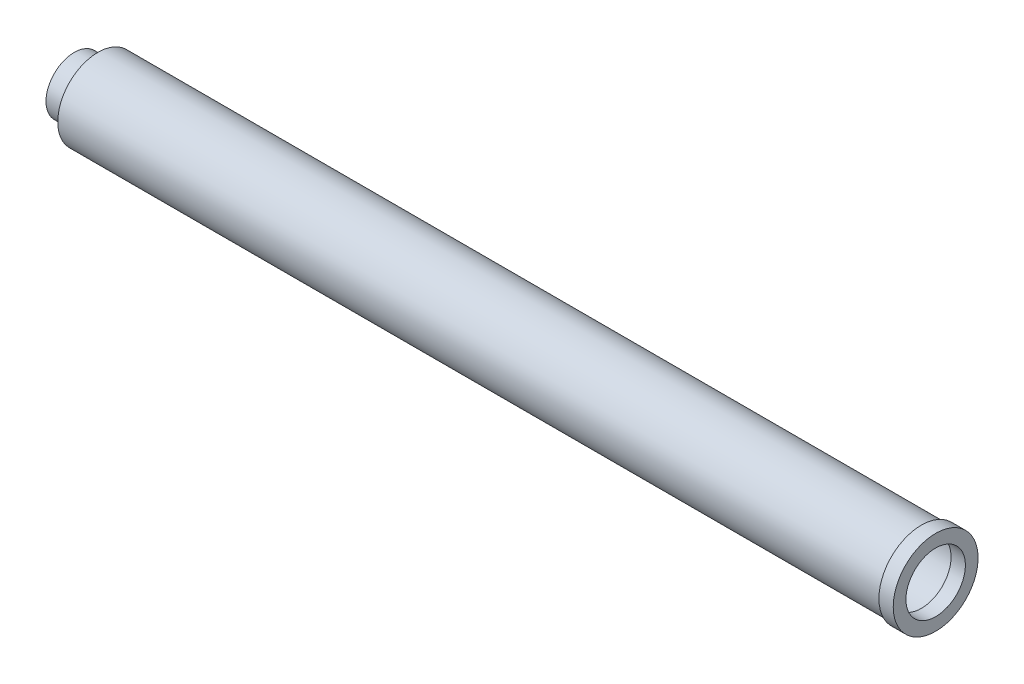
ISO-10303-21;
HEADER;
FILE_DESCRIPTION(('STEP AP214'),'2;1');
FILE_NAME('part.step','',(''),(''),'','','');
FILE_SCHEMA(('AUTOMOTIVE_DESIGN { 1 0 10303 214 1 1 1 1 }'));
ENDSEC;
DATA;
#1=APPLICATION_CONTEXT('core data for automotive mechanical design processes');
#2=APPLICATION_PROTOCOL_DEFINITION('international standard','automotive_design',2000,#1);
#3=PRODUCT_CONTEXT('',#1,'mechanical');
#4=PRODUCT('Part','Part','',(#3));
#5=PRODUCT_RELATED_PRODUCT_CATEGORY('part','',(#4));
#6=PRODUCT_DEFINITION_FORMATION('','',#4);
#7=PRODUCT_DEFINITION_CONTEXT('part definition',#1,'design');
#8=PRODUCT_DEFINITION('design','',#6,#7);
#9=PRODUCT_DEFINITION_SHAPE('','',#8);
#10=(LENGTH_UNIT() NAMED_UNIT(*) SI_UNIT(.MILLI.,.METRE.));
#11=(NAMED_UNIT(*) PLANE_ANGLE_UNIT() SI_UNIT($,.RADIAN.));
#12=(NAMED_UNIT(*) SI_UNIT($,.STERADIAN.) SOLID_ANGLE_UNIT());
#13=UNCERTAINTY_MEASURE_WITH_UNIT(LENGTH_MEASURE(1.E-05),#10,'distance_accuracy_value','');
#14=(GEOMETRIC_REPRESENTATION_CONTEXT(3) GLOBAL_UNCERTAINTY_ASSIGNED_CONTEXT((#13)) GLOBAL_UNIT_ASSIGNED_CONTEXT((#10,
#11,#12)) REPRESENTATION_CONTEXT('',''));
#15=CARTESIAN_POINT('',(0.,0.,0.));
#16=DIRECTION('',(0.,0.,1.));
#17=DIRECTION('',(1.,0.,0.));
#18=AXIS2_PLACEMENT_3D('',#15,#16,#17);
#19=CARTESIAN_POINT('',(-404.790100073339,0.,0.));
#20=DIRECTION('',(-1.,0.,0.));
#21=DIRECTION('',(0.,0.,1.));
#22=AXIS2_PLACEMENT_3D('',#19,#20,#21);
#23=CYLINDRICAL_SURFACE('',#22,25.4);
#24=CARTESIAN_POINT('',(357.249266674809,0.,0.));
#25=DIRECTION('',(-1.,0.,0.));
#26=DIRECTION('',(0.,0.,1.));
#27=AXIS2_PLACEMENT_3D('',#24,#25,#26);
#28=CIRCLE('',#27,25.4);
#29=CARTESIAN_POINT('',(357.249266674809,0.,25.4));
#30=VERTEX_POINT('',#29);
#31=EDGE_CURVE('E35',#30,#30,#28,.T.);
#32=ORIENTED_EDGE('',*,*,#31,.F.);
#33=EDGE_LOOP('',(#32));
#34=FACE_BOUND('',#33,.T.);
#35=CARTESIAN_POINT('',(-176.750733325191,0.,0.));
#36=DIRECTION('',(-1.,0.,0.));
#37=DIRECTION('',(0.,0.,1.));
#38=AXIS2_PLACEMENT_3D('',#35,#36,#37);
#39=CIRCLE('',#38,25.4);
#40=CARTESIAN_POINT('',(-176.750733325191,0.,25.4));
#41=VERTEX_POINT('',#40);
#42=EDGE_CURVE('E10',#41,#41,#39,.F.);
#43=ORIENTED_EDGE('',*,*,#42,.F.);
#44=EDGE_LOOP('',(#43));
#45=FACE_BOUND('',#44,.T.);
#46=ADVANCED_FACE('F32',(#34,#45),#23,.F.);
#47=CARTESIAN_POINT('',(-404.790100073339,0.,0.));
#48=DIRECTION('',(-1.,0.,0.));
#49=DIRECTION('',(0.,0.,1.));
#50=AXIS2_PLACEMENT_3D('',#47,#48,#49);
#51=CYLINDRICAL_SURFACE('',#50,27.);
#52=CARTESIAN_POINT('',(357.249266674809,0.,0.));
#53=DIRECTION('',(1.,0.,0.));
#54=DIRECTION('',(0.,0.,-1.));
#55=AXIS2_PLACEMENT_3D('',#52,#53,#54);
#56=CIRCLE('',#55,27.);
#57=CARTESIAN_POINT('',(357.249266674809,0.,-27.));
#58=VERTEX_POINT('',#57);
#59=EDGE_CURVE('E43',#58,#58,#56,.T.);
#60=ORIENTED_EDGE('',*,*,#59,.F.);
#61=EDGE_LOOP('',(#60));
#62=FACE_BOUND('',#61,.T.);
#63=CARTESIAN_POINT('',(-195.850733325191,0.,0.));
#64=DIRECTION('',(-1.,0.,0.));
#65=DIRECTION('',(0.,0.,1.));
#66=AXIS2_PLACEMENT_3D('',#63,#64,#65);
#67=CIRCLE('',#66,27.);
#68=CARTESIAN_POINT('',(-195.850733325191,0.,27.));
#69=VERTEX_POINT('',#68);
#70=EDGE_CURVE('E46',#69,#69,#67,.T.);
#71=ORIENTED_EDGE('',*,*,#70,.F.);
#72=EDGE_LOOP('',(#71));
#73=FACE_BOUND('',#72,.T.);
#74=ADVANCED_FACE('F65',(#62,#73),#51,.T.);
#75=CARTESIAN_POINT('',(357.249266674809,28.5,0.));
#76=DIRECTION('',(1.,0.,0.));
#77=DIRECTION('',(0.,0.,-1.));
#78=AXIS2_PLACEMENT_3D('',#75,#76,#77);
#79=PLANE('',#78);
#80=ORIENTED_EDGE('',*,*,#31,.T.);
#81=EDGE_LOOP('',(#80));
#82=FACE_BOUND('',#81,.T.);
#83=CARTESIAN_POINT('',(357.249266674809,0.,0.));
#84=DIRECTION('',(-1.,0.,0.));
#85=DIRECTION('',(0.,0.,1.));
#86=AXIS2_PLACEMENT_3D('',#83,#84,#85);
#87=CIRCLE('',#86,19.9750569381049);
#88=CARTESIAN_POINT('',(357.249266674809,0.,19.9750569381049));
#89=VERTEX_POINT('',#88);
#90=EDGE_CURVE('E54',#89,#89,#87,.T.);
#91=ORIENTED_EDGE('',*,*,#90,.F.);
#92=EDGE_LOOP('',(#91));
#93=FACE_BOUND('',#92,.T.);
#94=ADVANCED_FACE('F68',(#82,#93),#79,.F.);
#95=CARTESIAN_POINT('',(366.849266674809,28.5,0.));
#96=DIRECTION('',(-1.,0.,0.));
#97=DIRECTION('',(0.,0.,1.));
#98=AXIS2_PLACEMENT_3D('',#95,#96,#97);
#99=PLANE('',#98);
#100=CARTESIAN_POINT('',(366.849266674809,0.,0.));
#101=DIRECTION('',(-1.,0.,0.));
#102=DIRECTION('',(0.,0.,1.));
#103=AXIS2_PLACEMENT_3D('',#100,#101,#102);
#104=CIRCLE('',#103,28.5);
#105=CARTESIAN_POINT('',(366.849266674809,0.,28.5));
#106=VERTEX_POINT('',#105);
#107=EDGE_CURVE('E48',#106,#106,#104,.T.);
#108=ORIENTED_EDGE('',*,*,#107,.F.);
#109=EDGE_LOOP('',(#108));
#110=FACE_BOUND('',#109,.T.);
#111=CARTESIAN_POINT('',(366.849266674809,0.,0.));
#112=DIRECTION('',(-1.,0.,0.));
#113=DIRECTION('',(0.,0.,1.));
#114=AXIS2_PLACEMENT_3D('',#111,#112,#113);
#115=CIRCLE('',#114,19.9750569381049);
#116=CARTESIAN_POINT('',(366.849266674809,0.,19.9750569381049));
#117=VERTEX_POINT('',#116);
#118=EDGE_CURVE('E57',#117,#117,#115,.T.);
#119=ORIENTED_EDGE('',*,*,#118,.T.);
#120=EDGE_LOOP('',(#119));
#121=FACE_BOUND('',#120,.T.);
#122=ADVANCED_FACE('F119',(#110,#121),#99,.F.);
#123=CARTESIAN_POINT('',(-209.882463346187,0.,0.));
#124=DIRECTION('',(-1.,0.,0.));
#125=DIRECTION('',(0.,0.,1.));
#126=AXIS2_PLACEMENT_3D('',#123,#124,#125);
#127=CYLINDRICAL_SURFACE('',#126,19.9750569381049);
#128=ORIENTED_EDGE('',*,*,#118,.F.);
#129=EDGE_LOOP('',(#128));
#130=FACE_BOUND('',#129,.T.);
#131=ORIENTED_EDGE('',*,*,#90,.T.);
#132=EDGE_LOOP('',(#131));
#133=FACE_BOUND('',#132,.T.);
#134=ADVANCED_FACE('F123',(#130,#133),#127,.F.);
#135=ORIENTED_EDGE('',*,*,#59,.T.);
#136=EDGE_LOOP('',(#135));
#137=FACE_BOUND('',#136,.T.);
#138=CARTESIAN_POINT('',(357.249266674809,0.,0.));
#139=DIRECTION('',(-1.,0.,0.));
#140=DIRECTION('',(0.,0.,1.));
#141=AXIS2_PLACEMENT_3D('',#138,#139,#140);
#142=CIRCLE('',#141,28.5);
#143=CARTESIAN_POINT('',(357.249266674809,0.,28.5));
#144=VERTEX_POINT('',#143);
#145=EDGE_CURVE('E51',#144,#144,#142,.T.);
#146=ORIENTED_EDGE('',*,*,#145,.T.);
#147=EDGE_LOOP('',(#146));
#148=FACE_BOUND('',#147,.T.);
#149=ADVANCED_FACE('F62',(#137,#148),#79,.F.);
#150=CARTESIAN_POINT('',(-209.882463346187,0.,0.));
#151=DIRECTION('',(-1.,0.,0.));
#152=DIRECTION('',(0.,0.,1.));
#153=AXIS2_PLACEMENT_3D('',#150,#151,#152);
#154=CYLINDRICAL_SURFACE('',#153,28.5);
#155=ORIENTED_EDGE('',*,*,#145,.F.);
#156=EDGE_LOOP('',(#155));
#157=FACE_BOUND('',#156,.T.);
#158=ORIENTED_EDGE('',*,*,#107,.T.);
#159=EDGE_LOOP('',(#158));
#160=FACE_BOUND('',#159,.T.);
#161=ADVANCED_FACE('F131',(#157,#160),#154,.T.);
#162=CARTESIAN_POINT('',(-204.250733325191,11.,0.));
#163=DIRECTION('',(1.,0.,0.));
#164=DIRECTION('',(0.,0.,-1.));
#165=AXIS2_PLACEMENT_3D('',#162,#163,#164);
#166=PLANE('',#165);
#167=CARTESIAN_POINT('',(-204.250733325191,0.,0.));
#168=DIRECTION('',(-1.,0.,0.));
#169=DIRECTION('',(0.,0.,1.));
#170=AXIS2_PLACEMENT_3D('',#167,#168,#169);
#171=CIRCLE('',#170,11.);
#172=CARTESIAN_POINT('',(-204.250733325191,0.,11.));
#173=VERTEX_POINT('',#172);
#174=EDGE_CURVE('E83',#173,#173,#171,.T.);
#175=ORIENTED_EDGE('',*,*,#174,.T.);
#176=EDGE_LOOP('',(#175));
#177=FACE_BOUND('',#176,.T.);
#178=ADVANCED_FACE('F138',(#177),#166,.F.);
#179=CARTESIAN_POINT('',(-209.882463346187,0.,0.));
#180=DIRECTION('',(-1.,0.,0.));
#181=DIRECTION('',(0.,0.,1.));
#182=AXIS2_PLACEMENT_3D('',#179,#180,#181);
#183=CYLINDRICAL_SURFACE('',#182,11.);
#184=ORIENTED_EDGE('',*,*,#174,.F.);
#185=EDGE_LOOP('',(#184));
#186=FACE_BOUND('',#185,.T.);
#187=CARTESIAN_POINT('',(-211.750733325191,0.,0.));
#188=DIRECTION('',(-1.,0.,0.));
#189=DIRECTION('',(0.,0.,1.));
#190=AXIS2_PLACEMENT_3D('',#187,#188,#189);
#191=CIRCLE('',#190,11.);
#192=CARTESIAN_POINT('',(-211.750733325191,0.,11.));
#193=VERTEX_POINT('',#192);
#194=EDGE_CURVE('E78',#193,#193,#191,.T.);
#195=ORIENTED_EDGE('',*,*,#194,.T.);
#196=EDGE_LOOP('',(#195));
#197=FACE_BOUND('',#196,.T.);
#198=ADVANCED_FACE('F150',(#186,#197),#183,.F.);
#199=CARTESIAN_POINT('',(-211.750733325191,19.,0.));
#200=DIRECTION('',(1.,0.,0.));
#201=DIRECTION('',(0.,0.,-1.));
#202=AXIS2_PLACEMENT_3D('',#199,#200,#201);
#203=PLANE('',#202);
#204=ORIENTED_EDGE('',*,*,#194,.F.);
#205=EDGE_LOOP('',(#204));
#206=FACE_BOUND('',#205,.T.);
#207=CARTESIAN_POINT('',(-211.750733325191,0.,0.));
#208=DIRECTION('',(-1.,0.,0.));
#209=DIRECTION('',(0.,0.,1.));
#210=AXIS2_PLACEMENT_3D('',#207,#208,#209);
#211=CIRCLE('',#210,19.);
#212=CARTESIAN_POINT('',(-211.750733325191,0.,19.));
#213=VERTEX_POINT('',#212);
#214=EDGE_CURVE('E74',#213,#213,#211,.T.);
#215=ORIENTED_EDGE('',*,*,#214,.T.);
#216=EDGE_LOOP('',(#215));
#217=FACE_BOUND('',#216,.T.);
#218=ADVANCED_FACE('F146',(#206,#217),#203,.F.);
#219=CARTESIAN_POINT('',(-209.882463346187,0.,0.));
#220=DIRECTION('',(-1.,0.,0.));
#221=DIRECTION('',(0.,0.,1.));
#222=AXIS2_PLACEMENT_3D('',#219,#220,#221);
#223=CYLINDRICAL_SURFACE('',#222,19.);
#224=ORIENTED_EDGE('',*,*,#214,.F.);
#225=EDGE_LOOP('',(#224));
#226=FACE_BOUND('',#225,.T.);
#227=CARTESIAN_POINT('',(-195.850733325191,0.,0.));
#228=DIRECTION('',(-1.,0.,0.));
#229=DIRECTION('',(0.,0.,1.));
#230=AXIS2_PLACEMENT_3D('',#227,#228,#229);
#231=CIRCLE('',#230,19.);
#232=CARTESIAN_POINT('',(-195.850733325191,0.,19.));
#233=VERTEX_POINT('',#232);
#234=EDGE_CURVE('E72',#233,#233,#231,.T.);
#235=ORIENTED_EDGE('',*,*,#234,.T.);
#236=EDGE_LOOP('',(#235));
#237=FACE_BOUND('',#236,.T.);
#238=ADVANCED_FACE('F142',(#226,#237),#223,.T.);
#239=CARTESIAN_POINT('',(-195.850733325191,27.,0.));
#240=DIRECTION('',(1.,0.,0.));
#241=DIRECTION('',(0.,0.,-1.));
#242=AXIS2_PLACEMENT_3D('',#239,#240,#241);
#243=PLANE('',#242);
#244=ORIENTED_EDGE('',*,*,#234,.F.);
#245=EDGE_LOOP('',(#244));
#246=FACE_BOUND('',#245,.T.);
#247=ORIENTED_EDGE('',*,*,#70,.T.);
#248=EDGE_LOOP('',(#247));
#249=FACE_BOUND('',#248,.T.);
#250=ADVANCED_FACE('F107',(#246,#249),#243,.F.);
#251=CARTESIAN_POINT('',(-176.750733325191,27.,0.));
#252=DIRECTION('',(-1.,0.,0.));
#253=DIRECTION('',(0.,0.,1.));
#254=AXIS2_PLACEMENT_3D('',#251,#252,#253);
#255=PLANE('',#254);
#256=CARTESIAN_POINT('',(-176.750733325191,0.,0.));
#257=DIRECTION('',(-1.,0.,0.));
#258=DIRECTION('',(0.,0.,1.));
#259=AXIS2_PLACEMENT_3D('',#256,#257,#258);
#260=CIRCLE('',#259,14.5);
#261=CARTESIAN_POINT('',(-176.750733325191,0.,14.5));
#262=VERTEX_POINT('',#261);
#263=EDGE_CURVE('E89',#262,#262,#260,.T.);
#264=ORIENTED_EDGE('',*,*,#263,.T.);
#265=EDGE_LOOP('',(#264));
#266=FACE_BOUND('',#265,.T.);
#267=ORIENTED_EDGE('',*,*,#42,.T.);
#268=EDGE_LOOP('',(#267));
#269=FACE_BOUND('',#268,.T.);
#270=ADVANCED_FACE('F93',(#266,#269),#255,.F.);
#271=CARTESIAN_POINT('',(-202.260733325191,14.5,0.));
#272=DIRECTION('',(-1.,0.,0.));
#273=DIRECTION('',(0.,0.,1.));
#274=AXIS2_PLACEMENT_3D('',#271,#272,#273);
#275=PLANE('',#274);
#276=CARTESIAN_POINT('',(-202.260733325191,0.,0.));
#277=DIRECTION('',(-1.,0.,0.));
#278=DIRECTION('',(0.,0.,1.));
#279=AXIS2_PLACEMENT_3D('',#276,#277,#278);
#280=CIRCLE('',#279,14.5);
#281=CARTESIAN_POINT('',(-202.260733325191,0.,14.5));
#282=VERTEX_POINT('',#281);
#283=EDGE_CURVE('E86',#282,#282,#280,.T.);
#284=ORIENTED_EDGE('',*,*,#283,.F.);
#285=EDGE_LOOP('',(#284));
#286=FACE_BOUND('',#285,.T.);
#287=ADVANCED_FACE('F98',(#286),#275,.F.);
#288=CARTESIAN_POINT('',(-209.882463346187,0.,0.));
#289=DIRECTION('',(-1.,0.,0.));
#290=DIRECTION('',(0.,0.,1.));
#291=AXIS2_PLACEMENT_3D('',#288,#289,#290);
#292=CYLINDRICAL_SURFACE('',#291,14.5);
#293=ORIENTED_EDGE('',*,*,#263,.F.);
#294=EDGE_LOOP('',(#293));
#295=FACE_BOUND('',#294,.T.);
#296=ORIENTED_EDGE('',*,*,#283,.T.);
#297=EDGE_LOOP('',(#296));
#298=FACE_BOUND('',#297,.T.);
#299=ADVANCED_FACE('F95',(#295,#298),#292,.F.);
#300=CLOSED_SHELL('',(#46,#74,#94,#122,#134,#149,#161,#178,#198,#218,#238,#250,#270,#287,#299));
#301=MANIFOLD_SOLID_BREP('B2',#300);
#302=ADVANCED_BREP_SHAPE_REPRESENTATION('',(#18,#301),#14);
#303=SHAPE_DEFINITION_REPRESENTATION(#9,#302);
ENDSEC;
END-ISO-10303-21;
